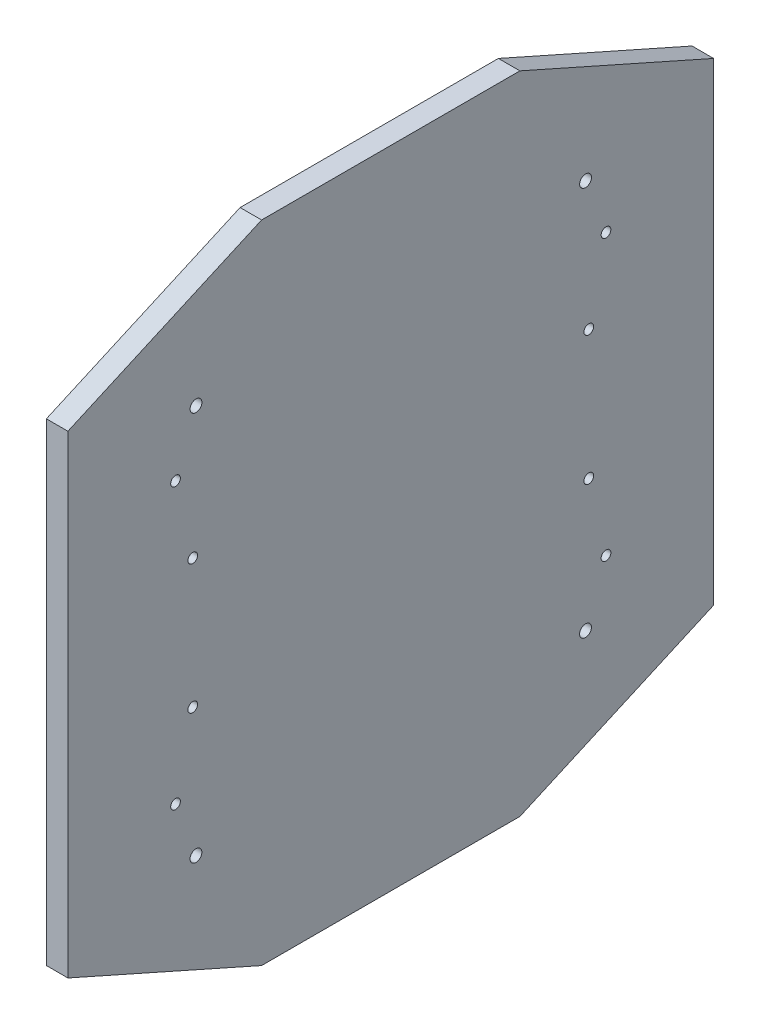
ISO-10303-21;
HEADER;
FILE_DESCRIPTION(('STEP AP214'),'2;1');
FILE_NAME('part.step','',(''),(''),'','','');
FILE_SCHEMA(('AUTOMOTIVE_DESIGN { 1 0 10303 214 1 1 1 1 }'));
ENDSEC;
DATA;
#1=APPLICATION_CONTEXT('core data for automotive mechanical design processes');
#2=APPLICATION_PROTOCOL_DEFINITION('international standard','automotive_design',2000,#1);
#3=PRODUCT_CONTEXT('',#1,'mechanical');
#4=PRODUCT('Part','Part','',(#3));
#5=PRODUCT_RELATED_PRODUCT_CATEGORY('part','',(#4));
#6=PRODUCT_DEFINITION_FORMATION('','',#4);
#7=PRODUCT_DEFINITION_CONTEXT('part definition',#1,'design');
#8=PRODUCT_DEFINITION('design','',#6,#7);
#9=PRODUCT_DEFINITION_SHAPE('','',#8);
#10=(LENGTH_UNIT() NAMED_UNIT(*) SI_UNIT(.MILLI.,.METRE.));
#11=(NAMED_UNIT(*) PLANE_ANGLE_UNIT() SI_UNIT($,.RADIAN.));
#12=(NAMED_UNIT(*) SI_UNIT($,.STERADIAN.) SOLID_ANGLE_UNIT());
#13=UNCERTAINTY_MEASURE_WITH_UNIT(LENGTH_MEASURE(1.E-05),#10,'distance_accuracy_value','');
#14=(GEOMETRIC_REPRESENTATION_CONTEXT(3) GLOBAL_UNCERTAINTY_ASSIGNED_CONTEXT((#13)) GLOBAL_UNIT_ASSIGNED_CONTEXT((#10,
#11,#12)) REPRESENTATION_CONTEXT('',''));
#15=CARTESIAN_POINT('',(0.,0.,0.));
#16=DIRECTION('',(0.,0.,1.));
#17=DIRECTION('',(1.,0.,0.));
#18=AXIS2_PLACEMENT_3D('',#15,#16,#17);
#19=CARTESIAN_POINT('',(10.,-110.,150.));
#20=DIRECTION('',(0.,0.913811548620257,-0.406138466053447));
#21=DIRECTION('',(0.,0.406138466053447,0.913811548620257));
#22=AXIS2_PLACEMENT_3D('',#19,#20,#21);
#23=PLANE('',#22);
#24=DIRECTION('',(0.,-0.406138466053447,-0.913811548620257));
#25=VECTOR('',#24,1.);
#26=CARTESIAN_POINT('',(0.,-110.,150.));
#27=LINE('',#26,#25);
#28=CARTESIAN_POINT('',(0.,-110.,150.));
#29=VERTEX_POINT('',#28);
#30=CARTESIAN_POINT('',(0.,-150.,60.));
#31=VERTEX_POINT('',#30);
#32=EDGE_CURVE('E133',#29,#31,#27,.T.);
#33=ORIENTED_EDGE('',*,*,#32,.T.);
#34=DIRECTION('',(-1.,0.,0.));
#35=VECTOR('',#34,1.);
#36=CARTESIAN_POINT('',(10.,-150.,60.));
#37=LINE('',#36,#35);
#38=CARTESIAN_POINT('',(10.,-150.,60.));
#39=VERTEX_POINT('',#38);
#40=EDGE_CURVE('E11',#39,#31,#37,.T.);
#41=ORIENTED_EDGE('',*,*,#40,.F.);
#42=DIRECTION('',(0.,-0.406138466053447,-0.913811548620257));
#43=VECTOR('',#42,1.);
#44=CARTESIAN_POINT('',(10.,-110.,150.));
#45=LINE('',#44,#43);
#46=CARTESIAN_POINT('',(10.,-110.,150.));
#47=VERTEX_POINT('',#46);
#48=EDGE_CURVE('E148',#47,#39,#45,.T.);
#49=ORIENTED_EDGE('',*,*,#48,.F.);
#50=DIRECTION('',(-1.,0.,0.));
#51=VECTOR('',#50,1.);
#52=CARTESIAN_POINT('',(10.,-110.,150.));
#53=LINE('',#52,#51);
#54=EDGE_CURVE('E129',#47,#29,#53,.T.);
#55=ORIENTED_EDGE('',*,*,#54,.T.);
#56=EDGE_LOOP('',(#33,#41,#49,#55));
#57=FACE_BOUND('',#56,.T.);
#58=ADVANCED_FACE('F37',(#57),#23,.F.);
#59=CARTESIAN_POINT('',(10.,-150.,60.));
#60=DIRECTION('',(0.,1.,0.));
#61=DIRECTION('',(0.,0.,1.));
#62=AXIS2_PLACEMENT_3D('',#59,#60,#61);
#63=PLANE('',#62);
#64=DIRECTION('',(0.,0.,-1.));
#65=VECTOR('',#64,1.);
#66=CARTESIAN_POINT('',(0.,-150.,60.));
#67=LINE('',#66,#65);
#68=CARTESIAN_POINT('',(0.,-150.,-60.));
#69=VERTEX_POINT('',#68);
#70=EDGE_CURVE('E136',#31,#69,#67,.T.);
#71=ORIENTED_EDGE('',*,*,#70,.T.);
#72=DIRECTION('',(-1.,0.,0.));
#73=VECTOR('',#72,1.);
#74=CARTESIAN_POINT('',(10.,-150.,-60.));
#75=LINE('',#74,#73);
#76=CARTESIAN_POINT('',(10.,-150.,-60.));
#77=VERTEX_POINT('',#76);
#78=EDGE_CURVE('E45',#77,#69,#75,.T.);
#79=ORIENTED_EDGE('',*,*,#78,.F.);
#80=DIRECTION('',(0.,0.,-1.));
#81=VECTOR('',#80,1.);
#82=CARTESIAN_POINT('',(10.,-150.,60.));
#83=LINE('',#82,#81);
#84=EDGE_CURVE('E96',#39,#77,#83,.T.);
#85=ORIENTED_EDGE('',*,*,#84,.F.);
#86=ORIENTED_EDGE('',*,*,#40,.T.);
#87=EDGE_LOOP('',(#71,#79,#85,#86));
#88=FACE_BOUND('',#87,.T.);
#89=ADVANCED_FACE('F303',(#88),#63,.F.);
#90=CARTESIAN_POINT('',(10.,-110.,-150.));
#91=DIRECTION('',(0.,0.913811548620257,0.406138466053447));
#92=DIRECTION('',(0.,-0.406138466053447,0.913811548620257));
#93=AXIS2_PLACEMENT_3D('',#90,#91,#92);
#94=PLANE('',#93);
#95=DIRECTION('',(0.,0.406138466053447,-0.913811548620257));
#96=VECTOR('',#95,1.);
#97=CARTESIAN_POINT('',(0.,-110.,-150.));
#98=LINE('',#97,#96);
#99=CARTESIAN_POINT('',(0.,-110.,-150.));
#100=VERTEX_POINT('',#99);
#101=EDGE_CURVE('E139',#69,#100,#98,.T.);
#102=ORIENTED_EDGE('',*,*,#101,.T.);
#103=DIRECTION('',(-1.,0.,0.));
#104=VECTOR('',#103,1.);
#105=CARTESIAN_POINT('',(10.,-110.,-150.));
#106=LINE('',#105,#104);
#107=CARTESIAN_POINT('',(10.,-110.,-150.));
#108=VERTEX_POINT('',#107);
#109=EDGE_CURVE('E155',#108,#100,#106,.T.);
#110=ORIENTED_EDGE('',*,*,#109,.F.);
#111=DIRECTION('',(0.,0.406138466053447,-0.913811548620257));
#112=VECTOR('',#111,1.);
#113=CARTESIAN_POINT('',(10.,-110.,-150.));
#114=LINE('',#113,#112);
#115=EDGE_CURVE('E163',#77,#108,#114,.T.);
#116=ORIENTED_EDGE('',*,*,#115,.F.);
#117=ORIENTED_EDGE('',*,*,#78,.T.);
#118=EDGE_LOOP('',(#102,#110,#116,#117));
#119=FACE_BOUND('',#118,.T.);
#120=ADVANCED_FACE('F161',(#119),#94,.F.);
#121=CARTESIAN_POINT('',(10.,-110.,-150.));
#122=DIRECTION('',(0.,0.,1.));
#123=DIRECTION('',(0.,-1.,0.));
#124=AXIS2_PLACEMENT_3D('',#121,#122,#123);
#125=PLANE('',#124);
#126=DIRECTION('',(0.,1.,0.));
#127=VECTOR('',#126,1.);
#128=CARTESIAN_POINT('',(0.,-110.,-150.));
#129=LINE('',#128,#127);
#130=CARTESIAN_POINT('',(0.,110.,-150.));
#131=VERTEX_POINT('',#130);
#132=EDGE_CURVE('E141',#100,#131,#129,.T.);
#133=ORIENTED_EDGE('',*,*,#132,.T.);
#134=DIRECTION('',(-1.,0.,0.));
#135=VECTOR('',#134,1.);
#136=CARTESIAN_POINT('',(10.,110.,-150.));
#137=LINE('',#136,#135);
#138=CARTESIAN_POINT('',(10.,110.,-150.));
#139=VERTEX_POINT('',#138);
#140=EDGE_CURVE('E152',#139,#131,#137,.T.);
#141=ORIENTED_EDGE('',*,*,#140,.F.);
#142=DIRECTION('',(0.,1.,0.));
#143=VECTOR('',#142,1.);
#144=CARTESIAN_POINT('',(10.,-110.,-150.));
#145=LINE('',#144,#143);
#146=EDGE_CURVE('E175',#108,#139,#145,.T.);
#147=ORIENTED_EDGE('',*,*,#146,.F.);
#148=ORIENTED_EDGE('',*,*,#109,.T.);
#149=EDGE_LOOP('',(#133,#141,#147,#148));
#150=FACE_BOUND('',#149,.T.);
#151=ADVANCED_FACE('F171',(#150),#125,.F.);
#152=CARTESIAN_POINT('',(10.,110.,-150.));
#153=DIRECTION('',(0.,-0.913811548620257,0.406138466053448));
#154=DIRECTION('',(0.,-0.406138466053448,-0.913811548620257));
#155=AXIS2_PLACEMENT_3D('',#152,#153,#154);
#156=PLANE('',#155);
#157=DIRECTION('',(0.,0.406138466053448,0.913811548620257));
#158=VECTOR('',#157,1.);
#159=CARTESIAN_POINT('',(0.,110.,-150.));
#160=LINE('',#159,#158);
#161=CARTESIAN_POINT('',(0.,150.,-60.));
#162=VERTEX_POINT('',#161);
#163=EDGE_CURVE('E143',#131,#162,#160,.T.);
#164=ORIENTED_EDGE('',*,*,#163,.T.);
#165=DIRECTION('',(-1.,0.,0.));
#166=VECTOR('',#165,1.);
#167=CARTESIAN_POINT('',(10.,150.,-60.));
#168=LINE('',#167,#166);
#169=CARTESIAN_POINT('',(10.,150.,-60.));
#170=VERTEX_POINT('',#169);
#171=EDGE_CURVE('E124',#170,#162,#168,.T.);
#172=ORIENTED_EDGE('',*,*,#171,.F.);
#173=DIRECTION('',(0.,0.406138466053448,0.913811548620257));
#174=VECTOR('',#173,1.);
#175=CARTESIAN_POINT('',(10.,110.,-150.));
#176=LINE('',#175,#174);
#177=EDGE_CURVE('E115',#139,#170,#176,.T.);
#178=ORIENTED_EDGE('',*,*,#177,.F.);
#179=ORIENTED_EDGE('',*,*,#140,.T.);
#180=EDGE_LOOP('',(#164,#172,#178,#179));
#181=FACE_BOUND('',#180,.T.);
#182=ADVANCED_FACE('F174',(#181),#156,.F.);
#183=CARTESIAN_POINT('',(10.,150.,60.));
#184=DIRECTION('',(0.,-1.,0.));
#185=DIRECTION('',(0.,0.,-1.));
#186=AXIS2_PLACEMENT_3D('',#183,#184,#185);
#187=PLANE('',#186);
#188=DIRECTION('',(0.,0.,1.));
#189=VECTOR('',#188,1.);
#190=CARTESIAN_POINT('',(0.,150.,60.));
#191=LINE('',#190,#189);
#192=CARTESIAN_POINT('',(0.,150.,60.));
#193=VERTEX_POINT('',#192);
#194=EDGE_CURVE('E123',#162,#193,#191,.T.);
#195=ORIENTED_EDGE('',*,*,#194,.T.);
#196=DIRECTION('',(-1.,0.,0.));
#197=VECTOR('',#196,1.);
#198=CARTESIAN_POINT('',(10.,150.,60.));
#199=LINE('',#198,#197);
#200=CARTESIAN_POINT('',(10.,150.,60.));
#201=VERTEX_POINT('',#200);
#202=EDGE_CURVE('E120',#201,#193,#199,.T.);
#203=ORIENTED_EDGE('',*,*,#202,.F.);
#204=DIRECTION('',(0.,0.,1.));
#205=VECTOR('',#204,1.);
#206=CARTESIAN_POINT('',(10.,150.,60.));
#207=LINE('',#206,#205);
#208=EDGE_CURVE('E109',#170,#201,#207,.T.);
#209=ORIENTED_EDGE('',*,*,#208,.F.);
#210=ORIENTED_EDGE('',*,*,#171,.T.);
#211=EDGE_LOOP('',(#195,#203,#209,#210));
#212=FACE_BOUND('',#211,.T.);
#213=ADVANCED_FACE('F121',(#212),#187,.F.);
#214=CARTESIAN_POINT('',(10.,110.,150.));
#215=DIRECTION('',(0.,-0.913811548620257,-0.406138466053448));
#216=DIRECTION('',(0.,0.406138466053448,-0.913811548620257));
#217=AXIS2_PLACEMENT_3D('',#214,#215,#216);
#218=PLANE('',#217);
#219=DIRECTION('',(0.,-0.406138466053448,0.913811548620257));
#220=VECTOR('',#219,1.);
#221=CARTESIAN_POINT('',(0.,110.,150.));
#222=LINE('',#221,#220);
#223=CARTESIAN_POINT('',(0.,110.,150.));
#224=VERTEX_POINT('',#223);
#225=EDGE_CURVE('E82',#193,#224,#222,.T.);
#226=ORIENTED_EDGE('',*,*,#225,.T.);
#227=DIRECTION('',(-1.,0.,0.));
#228=VECTOR('',#227,1.);
#229=CARTESIAN_POINT('',(10.,110.,150.));
#230=LINE('',#229,#228);
#231=CARTESIAN_POINT('',(10.,110.,150.));
#232=VERTEX_POINT('',#231);
#233=EDGE_CURVE('E125',#232,#224,#230,.T.);
#234=ORIENTED_EDGE('',*,*,#233,.F.);
#235=DIRECTION('',(0.,-0.406138466053448,0.913811548620257));
#236=VECTOR('',#235,1.);
#237=CARTESIAN_POINT('',(10.,110.,150.));
#238=LINE('',#237,#236);
#239=EDGE_CURVE('E113',#201,#232,#238,.T.);
#240=ORIENTED_EDGE('',*,*,#239,.F.);
#241=ORIENTED_EDGE('',*,*,#202,.T.);
#242=EDGE_LOOP('',(#226,#234,#240,#241));
#243=FACE_BOUND('',#242,.T.);
#244=ADVANCED_FACE('F127',(#243),#218,.F.);
#245=CARTESIAN_POINT('',(10.,-110.,150.));
#246=DIRECTION('',(0.,0.,-1.));
#247=DIRECTION('',(0.,1.,0.));
#248=AXIS2_PLACEMENT_3D('',#245,#246,#247);
#249=PLANE('',#248);
#250=DIRECTION('',(0.,-1.,0.));
#251=VECTOR('',#250,1.);
#252=CARTESIAN_POINT('',(0.,-110.,150.));
#253=LINE('',#252,#251);
#254=EDGE_CURVE('E88',#224,#29,#253,.T.);
#255=ORIENTED_EDGE('',*,*,#254,.T.);
#256=ORIENTED_EDGE('',*,*,#54,.F.);
#257=DIRECTION('',(0.,-1.,0.));
#258=VECTOR('',#257,1.);
#259=CARTESIAN_POINT('',(10.,-110.,150.));
#260=LINE('',#259,#258);
#261=EDGE_CURVE('E53',#232,#47,#260,.T.);
#262=ORIENTED_EDGE('',*,*,#261,.F.);
#263=ORIENTED_EDGE('',*,*,#233,.T.);
#264=EDGE_LOOP('',(#255,#256,#262,#263));
#265=FACE_BOUND('',#264,.T.);
#266=ADVANCED_FACE('F265',(#265),#249,.F.);
#267=CARTESIAN_POINT('',(10.,0.,0.));
#268=DIRECTION('',(1.,0.,0.));
#269=DIRECTION('',(0.,0.,-1.));
#270=AXIS2_PLACEMENT_3D('',#267,#268,#269);
#271=PLANE('',#270);
#272=CARTESIAN_POINT('',(10.,90.5,-90.5));
#273=DIRECTION('',(1.,0.,0.));
#274=DIRECTION('',(0.,0.,-1.));
#275=AXIS2_PLACEMENT_3D('',#272,#273,#274);
#276=CIRCLE('',#275,2.75000000000001);
#277=CARTESIAN_POINT('',(10.,90.5,-93.25));
#278=VERTEX_POINT('',#277);
#279=EDGE_CURVE('E242',#278,#278,#276,.T.);
#280=ORIENTED_EDGE('',*,*,#279,.F.);
#281=EDGE_LOOP('',(#280));
#282=FACE_BOUND('',#281,.T.);
#283=CARTESIAN_POINT('',(10.,-90.5,90.5));
#284=DIRECTION('',(1.,0.,0.));
#285=DIRECTION('',(0.,0.,-1.));
#286=AXIS2_PLACEMENT_3D('',#283,#284,#285);
#287=CIRCLE('',#286,2.75000000000001);
#288=CARTESIAN_POINT('',(10.,-90.5,87.75));
#289=VERTEX_POINT('',#288);
#290=EDGE_CURVE('E235',#289,#289,#287,.T.);
#291=ORIENTED_EDGE('',*,*,#290,.F.);
#292=EDGE_LOOP('',(#291));
#293=FACE_BOUND('',#292,.T.);
#294=CARTESIAN_POINT('',(10.,-90.5,-90.5));
#295=DIRECTION('',(1.,0.,0.));
#296=DIRECTION('',(0.,0.,-1.));
#297=AXIS2_PLACEMENT_3D('',#294,#295,#296);
#298=CIRCLE('',#297,2.75000000000001);
#299=CARTESIAN_POINT('',(10.,-90.5,-93.25));
#300=VERTEX_POINT('',#299);
#301=EDGE_CURVE('E247',#300,#300,#298,.T.);
#302=ORIENTED_EDGE('',*,*,#301,.F.);
#303=EDGE_LOOP('',(#302));
#304=FACE_BOUND('',#303,.T.);
#305=CARTESIAN_POINT('',(10.,90.5,90.5));
#306=DIRECTION('',(1.,0.,0.));
#307=DIRECTION('',(0.,0.,-1.));
#308=AXIS2_PLACEMENT_3D('',#305,#306,#307);
#309=CIRCLE('',#308,2.75000000000001);
#310=CARTESIAN_POINT('',(10.,90.5,87.75));
#311=VERTEX_POINT('',#310);
#312=EDGE_CURVE('E229',#311,#311,#309,.T.);
#313=ORIENTED_EDGE('',*,*,#312,.F.);
#314=EDGE_LOOP('',(#313));
#315=FACE_BOUND('',#314,.T.);
#316=CARTESIAN_POINT('',(10.,-30.,-92.));
#317=DIRECTION('',(1.,0.,0.));
#318=DIRECTION('',(0.,0.,-1.));
#319=AXIS2_PLACEMENT_3D('',#316,#317,#318);
#320=CIRCLE('',#319,2.25);
#321=CARTESIAN_POINT('',(10.,-30.,-94.25));
#322=VERTEX_POINT('',#321);
#323=EDGE_CURVE('E206',#322,#322,#320,.T.);
#324=ORIENTED_EDGE('',*,*,#323,.F.);
#325=EDGE_LOOP('',(#324));
#326=FACE_BOUND('',#325,.T.);
#327=CARTESIAN_POINT('',(10.,65.,-100.));
#328=DIRECTION('',(1.,0.,0.));
#329=DIRECTION('',(0.,0.,-1.));
#330=AXIS2_PLACEMENT_3D('',#327,#328,#329);
#331=CIRCLE('',#330,2.25);
#332=CARTESIAN_POINT('',(10.,65.,-102.25));
#333=VERTEX_POINT('',#332);
#334=EDGE_CURVE('E200',#333,#333,#331,.T.);
#335=ORIENTED_EDGE('',*,*,#334,.F.);
#336=EDGE_LOOP('',(#335));
#337=FACE_BOUND('',#336,.T.);
#338=CARTESIAN_POINT('',(10.,-65.,-100.));
#339=DIRECTION('',(1.,0.,0.));
#340=DIRECTION('',(0.,0.,-1.));
#341=AXIS2_PLACEMENT_3D('',#338,#339,#340);
#342=CIRCLE('',#341,2.25);
#343=CARTESIAN_POINT('',(10.,-65.,-102.25));
#344=VERTEX_POINT('',#343);
#345=EDGE_CURVE('E194',#344,#344,#342,.T.);
#346=ORIENTED_EDGE('',*,*,#345,.F.);
#347=EDGE_LOOP('',(#346));
#348=FACE_BOUND('',#347,.T.);
#349=CARTESIAN_POINT('',(10.,-65.,100.));
#350=DIRECTION('',(1.,0.,0.));
#351=DIRECTION('',(0.,0.,1.));
#352=AXIS2_PLACEMENT_3D('',#349,#350,#351);
#353=CIRCLE('',#352,2.25);
#354=CARTESIAN_POINT('',(10.,-65.,102.25));
#355=VERTEX_POINT('',#354);
#356=EDGE_CURVE('E187',#355,#355,#353,.T.);
#357=ORIENTED_EDGE('',*,*,#356,.F.);
#358=EDGE_LOOP('',(#357));
#359=FACE_BOUND('',#358,.T.);
#360=CARTESIAN_POINT('',(10.,30.,92.));
#361=DIRECTION('',(1.,0.,0.));
#362=DIRECTION('',(0.,0.,1.));
#363=AXIS2_PLACEMENT_3D('',#360,#361,#362);
#364=CIRCLE('',#363,2.25);
#365=CARTESIAN_POINT('',(10.,30.,94.25));
#366=VERTEX_POINT('',#365);
#367=EDGE_CURVE('E223',#366,#366,#364,.T.);
#368=ORIENTED_EDGE('',*,*,#367,.F.);
#369=EDGE_LOOP('',(#368));
#370=FACE_BOUND('',#369,.T.);
#371=CARTESIAN_POINT('',(10.,-30.,92.));
#372=DIRECTION('',(1.,0.,0.));
#373=DIRECTION('',(0.,0.,1.));
#374=AXIS2_PLACEMENT_3D('',#371,#372,#373);
#375=CIRCLE('',#374,2.25);
#376=CARTESIAN_POINT('',(10.,-30.,94.25));
#377=VERTEX_POINT('',#376);
#378=EDGE_CURVE('E211',#377,#377,#375,.T.);
#379=ORIENTED_EDGE('',*,*,#378,.F.);
#380=EDGE_LOOP('',(#379));
#381=FACE_BOUND('',#380,.T.);
#382=CARTESIAN_POINT('',(10.,65.,100.));
#383=DIRECTION('',(1.,0.,0.));
#384=DIRECTION('',(0.,0.,1.));
#385=AXIS2_PLACEMENT_3D('',#382,#383,#384);
#386=CIRCLE('',#385,2.25);
#387=CARTESIAN_POINT('',(10.,65.,102.25));
#388=VERTEX_POINT('',#387);
#389=EDGE_CURVE('E218',#388,#388,#386,.T.);
#390=ORIENTED_EDGE('',*,*,#389,.F.);
#391=EDGE_LOOP('',(#390));
#392=FACE_BOUND('',#391,.T.);
#393=CARTESIAN_POINT('',(10.,30.,-92.));
#394=DIRECTION('',(1.,0.,0.));
#395=DIRECTION('',(0.,0.,-1.));
#396=AXIS2_PLACEMENT_3D('',#393,#394,#395);
#397=CIRCLE('',#396,2.25);
#398=CARTESIAN_POINT('',(10.,30.,-94.25));
#399=VERTEX_POINT('',#398);
#400=EDGE_CURVE('E181',#399,#399,#397,.T.);
#401=ORIENTED_EDGE('',*,*,#400,.F.);
#402=EDGE_LOOP('',(#401));
#403=FACE_BOUND('',#402,.T.);
#404=ORIENTED_EDGE('',*,*,#48,.T.);
#405=ORIENTED_EDGE('',*,*,#84,.T.);
#406=ORIENTED_EDGE('',*,*,#115,.T.);
#407=ORIENTED_EDGE('',*,*,#146,.T.);
#408=ORIENTED_EDGE('',*,*,#177,.T.);
#409=ORIENTED_EDGE('',*,*,#208,.T.);
#410=ORIENTED_EDGE('',*,*,#239,.T.);
#411=ORIENTED_EDGE('',*,*,#261,.T.);
#412=EDGE_LOOP('',(#404,#405,#406,#407,#408,#409,#410,#411));
#413=FACE_BOUND('',#412,.T.);
#414=ADVANCED_FACE('F111',(#282,#293,#304,#315,#326,#337,#348,#359,#370,#381,#392,#403,#413),
#271,.T.);
#415=CARTESIAN_POINT('',(0.,0.,0.));
#416=DIRECTION('',(1.,0.,0.));
#417=DIRECTION('',(0.,0.,-1.));
#418=AXIS2_PLACEMENT_3D('',#415,#416,#417);
#419=PLANE('',#418);
#420=CARTESIAN_POINT('',(0.,90.5,-90.5));
#421=DIRECTION('',(1.,0.,0.));
#422=DIRECTION('',(0.,0.,-1.));
#423=AXIS2_PLACEMENT_3D('',#420,#421,#422);
#424=CIRCLE('',#423,2.75000000000001);
#425=CARTESIAN_POINT('',(0.,90.5,-93.25));
#426=VERTEX_POINT('',#425);
#427=EDGE_CURVE('E232',#426,#426,#424,.T.);
#428=ORIENTED_EDGE('',*,*,#427,.T.);
#429=EDGE_LOOP('',(#428));
#430=FACE_BOUND('',#429,.T.);
#431=CARTESIAN_POINT('',(0.,-90.5,90.5));
#432=DIRECTION('',(1.,0.,0.));
#433=DIRECTION('',(0.,0.,-1.));
#434=AXIS2_PLACEMENT_3D('',#431,#432,#433);
#435=CIRCLE('',#434,2.75000000000001);
#436=CARTESIAN_POINT('',(0.,-90.5,87.75));
#437=VERTEX_POINT('',#436);
#438=EDGE_CURVE('E238',#437,#437,#435,.T.);
#439=ORIENTED_EDGE('',*,*,#438,.T.);
#440=EDGE_LOOP('',(#439));
#441=FACE_BOUND('',#440,.T.);
#442=CARTESIAN_POINT('',(0.,-90.5,-90.5));
#443=DIRECTION('',(1.,0.,0.));
#444=DIRECTION('',(0.,0.,-1.));
#445=AXIS2_PLACEMENT_3D('',#442,#443,#444);
#446=CIRCLE('',#445,2.75000000000001);
#447=CARTESIAN_POINT('',(0.,-90.5,-93.25));
#448=VERTEX_POINT('',#447);
#449=EDGE_CURVE('E239',#448,#448,#446,.T.);
#450=ORIENTED_EDGE('',*,*,#449,.T.);
#451=EDGE_LOOP('',(#450));
#452=FACE_BOUND('',#451,.T.);
#453=CARTESIAN_POINT('',(0.,90.5,90.5));
#454=DIRECTION('',(1.,0.,0.));
#455=DIRECTION('',(0.,0.,-1.));
#456=AXIS2_PLACEMENT_3D('',#453,#454,#455);
#457=CIRCLE('',#456,2.75000000000001);
#458=CARTESIAN_POINT('',(0.,90.5,87.75));
#459=VERTEX_POINT('',#458);
#460=EDGE_CURVE('E226',#459,#459,#457,.T.);
#461=ORIENTED_EDGE('',*,*,#460,.T.);
#462=EDGE_LOOP('',(#461));
#463=FACE_BOUND('',#462,.T.);
#464=CARTESIAN_POINT('',(0.,-30.,-92.));
#465=DIRECTION('',(1.,0.,0.));
#466=DIRECTION('',(0.,0.,-1.));
#467=AXIS2_PLACEMENT_3D('',#464,#465,#466);
#468=CIRCLE('',#467,2.25);
#469=CARTESIAN_POINT('',(0.,-30.,-94.25));
#470=VERTEX_POINT('',#469);
#471=EDGE_CURVE('E184',#470,#470,#468,.T.);
#472=ORIENTED_EDGE('',*,*,#471,.T.);
#473=EDGE_LOOP('',(#472));
#474=FACE_BOUND('',#473,.T.);
#475=CARTESIAN_POINT('',(0.,65.,-100.));
#476=DIRECTION('',(1.,0.,0.));
#477=DIRECTION('',(0.,0.,-1.));
#478=AXIS2_PLACEMENT_3D('',#475,#476,#477);
#479=CIRCLE('',#478,2.25);
#480=CARTESIAN_POINT('',(0.,65.,-102.25));
#481=VERTEX_POINT('',#480);
#482=EDGE_CURVE('E203',#481,#481,#479,.T.);
#483=ORIENTED_EDGE('',*,*,#482,.T.);
#484=EDGE_LOOP('',(#483));
#485=FACE_BOUND('',#484,.T.);
#486=CARTESIAN_POINT('',(0.,-65.,-100.));
#487=DIRECTION('',(1.,0.,0.));
#488=DIRECTION('',(0.,0.,-1.));
#489=AXIS2_PLACEMENT_3D('',#486,#487,#488);
#490=CIRCLE('',#489,2.25);
#491=CARTESIAN_POINT('',(0.,-65.,-102.25));
#492=VERTEX_POINT('',#491);
#493=EDGE_CURVE('E197',#492,#492,#490,.T.);
#494=ORIENTED_EDGE('',*,*,#493,.T.);
#495=EDGE_LOOP('',(#494));
#496=FACE_BOUND('',#495,.T.);
#497=CARTESIAN_POINT('',(0.,-65.,100.));
#498=DIRECTION('',(1.,0.,0.));
#499=DIRECTION('',(0.,0.,1.));
#500=AXIS2_PLACEMENT_3D('',#497,#498,#499);
#501=CIRCLE('',#500,2.25);
#502=CARTESIAN_POINT('',(0.,-65.,102.25));
#503=VERTEX_POINT('',#502);
#504=EDGE_CURVE('E190',#503,#503,#501,.T.);
#505=ORIENTED_EDGE('',*,*,#504,.T.);
#506=EDGE_LOOP('',(#505));
#507=FACE_BOUND('',#506,.T.);
#508=CARTESIAN_POINT('',(0.,30.,92.));
#509=DIRECTION('',(1.,0.,0.));
#510=DIRECTION('',(0.,0.,1.));
#511=AXIS2_PLACEMENT_3D('',#508,#509,#510);
#512=CIRCLE('',#511,2.25);
#513=CARTESIAN_POINT('',(0.,30.,94.25));
#514=VERTEX_POINT('',#513);
#515=EDGE_CURVE('E215',#514,#514,#512,.T.);
#516=ORIENTED_EDGE('',*,*,#515,.T.);
#517=EDGE_LOOP('',(#516));
#518=FACE_BOUND('',#517,.T.);
#519=CARTESIAN_POINT('',(0.,-30.,92.));
#520=DIRECTION('',(1.,0.,0.));
#521=DIRECTION('',(0.,0.,1.));
#522=AXIS2_PLACEMENT_3D('',#519,#520,#521);
#523=CIRCLE('',#522,2.25);
#524=CARTESIAN_POINT('',(0.,-30.,94.25));
#525=VERTEX_POINT('',#524);
#526=EDGE_CURVE('E214',#525,#525,#523,.T.);
#527=ORIENTED_EDGE('',*,*,#526,.T.);
#528=EDGE_LOOP('',(#527));
#529=FACE_BOUND('',#528,.T.);
#530=CARTESIAN_POINT('',(0.,65.,100.));
#531=DIRECTION('',(1.,0.,0.));
#532=DIRECTION('',(0.,0.,1.));
#533=AXIS2_PLACEMENT_3D('',#530,#531,#532);
#534=CIRCLE('',#533,2.25);
#535=CARTESIAN_POINT('',(0.,65.,102.25));
#536=VERTEX_POINT('',#535);
#537=EDGE_CURVE('E191',#536,#536,#534,.T.);
#538=ORIENTED_EDGE('',*,*,#537,.T.);
#539=EDGE_LOOP('',(#538));
#540=FACE_BOUND('',#539,.T.);
#541=CARTESIAN_POINT('',(0.,30.,-92.));
#542=DIRECTION('',(1.,0.,0.));
#543=DIRECTION('',(0.,0.,-1.));
#544=AXIS2_PLACEMENT_3D('',#541,#542,#543);
#545=CIRCLE('',#544,2.25);
#546=CARTESIAN_POINT('',(0.,30.,-94.25));
#547=VERTEX_POINT('',#546);
#548=EDGE_CURVE('E137',#547,#547,#545,.T.);
#549=ORIENTED_EDGE('',*,*,#548,.T.);
#550=EDGE_LOOP('',(#549));
#551=FACE_BOUND('',#550,.T.);
#552=ORIENTED_EDGE('',*,*,#32,.F.);
#553=ORIENTED_EDGE('',*,*,#254,.F.);
#554=ORIENTED_EDGE('',*,*,#225,.F.);
#555=ORIENTED_EDGE('',*,*,#194,.F.);
#556=ORIENTED_EDGE('',*,*,#163,.F.);
#557=ORIENTED_EDGE('',*,*,#132,.F.);
#558=ORIENTED_EDGE('',*,*,#101,.F.);
#559=ORIENTED_EDGE('',*,*,#70,.F.);
#560=EDGE_LOOP('',(#552,#553,#554,#555,#556,#557,#558,#559));
#561=FACE_BOUND('',#560,.T.);
#562=ADVANCED_FACE('F167',(#430,#441,#452,#463,#474,#485,#496,#507,#518,#529,#540,#551,#561),
#419,.F.);
#563=CARTESIAN_POINT('',(0.,30.,-92.));
#564=DIRECTION('',(1.,0.,0.));
#565=DIRECTION('',(0.,0.,-1.));
#566=AXIS2_PLACEMENT_3D('',#563,#564,#565);
#567=CYLINDRICAL_SURFACE('',#566,2.25);
#568=ORIENTED_EDGE('',*,*,#548,.F.);
#569=EDGE_LOOP('',(#568));
#570=FACE_BOUND('',#569,.T.);
#571=ORIENTED_EDGE('',*,*,#400,.T.);
#572=EDGE_LOOP('',(#571));
#573=FACE_BOUND('',#572,.T.);
#574=ADVANCED_FACE('F286',(#570,#573),#567,.F.);
#575=CARTESIAN_POINT('',(0.,65.,100.));
#576=DIRECTION('',(1.,0.,0.));
#577=DIRECTION('',(0.,0.,-1.));
#578=AXIS2_PLACEMENT_3D('',#575,#576,#577);
#579=CYLINDRICAL_SURFACE('',#578,2.25);
#580=ORIENTED_EDGE('',*,*,#537,.F.);
#581=EDGE_LOOP('',(#580));
#582=FACE_BOUND('',#581,.T.);
#583=ORIENTED_EDGE('',*,*,#389,.T.);
#584=EDGE_LOOP('',(#583));
#585=FACE_BOUND('',#584,.T.);
#586=ADVANCED_FACE('F288',(#582,#585),#579,.F.);
#587=CARTESIAN_POINT('',(0.,-30.,92.));
#588=DIRECTION('',(1.,0.,0.));
#589=DIRECTION('',(0.,0.,-1.));
#590=AXIS2_PLACEMENT_3D('',#587,#588,#589);
#591=CYLINDRICAL_SURFACE('',#590,2.25);
#592=ORIENTED_EDGE('',*,*,#526,.F.);
#593=EDGE_LOOP('',(#592));
#594=FACE_BOUND('',#593,.T.);
#595=ORIENTED_EDGE('',*,*,#378,.T.);
#596=EDGE_LOOP('',(#595));
#597=FACE_BOUND('',#596,.T.);
#598=ADVANCED_FACE('F295',(#594,#597),#591,.F.);
#599=CARTESIAN_POINT('',(0.,30.,92.));
#600=DIRECTION('',(1.,0.,0.));
#601=DIRECTION('',(0.,0.,-1.));
#602=AXIS2_PLACEMENT_3D('',#599,#600,#601);
#603=CYLINDRICAL_SURFACE('',#602,2.25);
#604=ORIENTED_EDGE('',*,*,#515,.F.);
#605=EDGE_LOOP('',(#604));
#606=FACE_BOUND('',#605,.T.);
#607=ORIENTED_EDGE('',*,*,#367,.T.);
#608=EDGE_LOOP('',(#607));
#609=FACE_BOUND('',#608,.T.);
#610=ADVANCED_FACE('F369',(#606,#609),#603,.F.);
#611=CARTESIAN_POINT('',(0.,-65.,100.));
#612=DIRECTION('',(1.,0.,0.));
#613=DIRECTION('',(0.,0.,-1.));
#614=AXIS2_PLACEMENT_3D('',#611,#612,#613);
#615=CYLINDRICAL_SURFACE('',#614,2.25);
#616=ORIENTED_EDGE('',*,*,#504,.F.);
#617=EDGE_LOOP('',(#616));
#618=FACE_BOUND('',#617,.T.);
#619=ORIENTED_EDGE('',*,*,#356,.T.);
#620=EDGE_LOOP('',(#619));
#621=FACE_BOUND('',#620,.T.);
#622=ADVANCED_FACE('F379',(#618,#621),#615,.F.);
#623=CARTESIAN_POINT('',(0.,-65.,-100.));
#624=DIRECTION('',(1.,0.,0.));
#625=DIRECTION('',(0.,0.,-1.));
#626=AXIS2_PLACEMENT_3D('',#623,#624,#625);
#627=CYLINDRICAL_SURFACE('',#626,2.25);
#628=ORIENTED_EDGE('',*,*,#493,.F.);
#629=EDGE_LOOP('',(#628));
#630=FACE_BOUND('',#629,.T.);
#631=ORIENTED_EDGE('',*,*,#345,.T.);
#632=EDGE_LOOP('',(#631));
#633=FACE_BOUND('',#632,.T.);
#634=ADVANCED_FACE('F389',(#630,#633),#627,.F.);
#635=CARTESIAN_POINT('',(0.,65.,-100.));
#636=DIRECTION('',(1.,0.,0.));
#637=DIRECTION('',(0.,0.,-1.));
#638=AXIS2_PLACEMENT_3D('',#635,#636,#637);
#639=CYLINDRICAL_SURFACE('',#638,2.25);
#640=ORIENTED_EDGE('',*,*,#482,.F.);
#641=EDGE_LOOP('',(#640));
#642=FACE_BOUND('',#641,.T.);
#643=ORIENTED_EDGE('',*,*,#334,.T.);
#644=EDGE_LOOP('',(#643));
#645=FACE_BOUND('',#644,.T.);
#646=ADVANCED_FACE('F398',(#642,#645),#639,.F.);
#647=CARTESIAN_POINT('',(0.,-30.,-92.));
#648=DIRECTION('',(1.,0.,0.));
#649=DIRECTION('',(0.,0.,-1.));
#650=AXIS2_PLACEMENT_3D('',#647,#648,#649);
#651=CYLINDRICAL_SURFACE('',#650,2.25);
#652=ORIENTED_EDGE('',*,*,#471,.F.);
#653=EDGE_LOOP('',(#652));
#654=FACE_BOUND('',#653,.T.);
#655=ORIENTED_EDGE('',*,*,#323,.T.);
#656=EDGE_LOOP('',(#655));
#657=FACE_BOUND('',#656,.T.);
#658=ADVANCED_FACE('F408',(#654,#657),#651,.F.);
#659=CARTESIAN_POINT('',(0.,90.5,90.5));
#660=DIRECTION('',(1.,0.,0.));
#661=DIRECTION('',(0.,0.,-1.));
#662=AXIS2_PLACEMENT_3D('',#659,#660,#661);
#663=CYLINDRICAL_SURFACE('',#662,2.75000000000001);
#664=ORIENTED_EDGE('',*,*,#460,.F.);
#665=EDGE_LOOP('',(#664));
#666=FACE_BOUND('',#665,.T.);
#667=ORIENTED_EDGE('',*,*,#312,.T.);
#668=EDGE_LOOP('',(#667));
#669=FACE_BOUND('',#668,.T.);
#670=ADVANCED_FACE('F259',(#666,#669),#663,.F.);
#671=CARTESIAN_POINT('',(0.,-90.5,-90.5));
#672=DIRECTION('',(1.,0.,0.));
#673=DIRECTION('',(0.,0.,-1.));
#674=AXIS2_PLACEMENT_3D('',#671,#672,#673);
#675=CYLINDRICAL_SURFACE('',#674,2.75000000000001);
#676=ORIENTED_EDGE('',*,*,#449,.F.);
#677=EDGE_LOOP('',(#676));
#678=FACE_BOUND('',#677,.T.);
#679=ORIENTED_EDGE('',*,*,#301,.T.);
#680=EDGE_LOOP('',(#679));
#681=FACE_BOUND('',#680,.T.);
#682=ADVANCED_FACE('F255',(#678,#681),#675,.F.);
#683=CARTESIAN_POINT('',(0.,-90.5,90.5));
#684=DIRECTION('',(1.,0.,0.));
#685=DIRECTION('',(0.,0.,-1.));
#686=AXIS2_PLACEMENT_3D('',#683,#684,#685);
#687=CYLINDRICAL_SURFACE('',#686,2.75000000000001);
#688=ORIENTED_EDGE('',*,*,#438,.F.);
#689=EDGE_LOOP('',(#688));
#690=FACE_BOUND('',#689,.T.);
#691=ORIENTED_EDGE('',*,*,#290,.T.);
#692=EDGE_LOOP('',(#691));
#693=FACE_BOUND('',#692,.T.);
#694=ADVANCED_FACE('F258',(#690,#693),#687,.F.);
#695=CARTESIAN_POINT('',(0.,90.5,-90.5));
#696=DIRECTION('',(1.,0.,0.));
#697=DIRECTION('',(0.,0.,-1.));
#698=AXIS2_PLACEMENT_3D('',#695,#696,#697);
#699=CYLINDRICAL_SURFACE('',#698,2.75000000000001);
#700=ORIENTED_EDGE('',*,*,#427,.F.);
#701=EDGE_LOOP('',(#700));
#702=FACE_BOUND('',#701,.T.);
#703=ORIENTED_EDGE('',*,*,#279,.T.);
#704=EDGE_LOOP('',(#703));
#705=FACE_BOUND('',#704,.T.);
#706=ADVANCED_FACE('F452',(#702,#705),#699,.F.);
#707=CLOSED_SHELL('',(#58,#89,#120,#151,#182,#213,#244,#266,#414,#562,#574,#586,#598,#610,#622,
#634,#646,#658,#670,#682,#694,#706));
#708=MANIFOLD_SOLID_BREP('B2',#707);
#709=ADVANCED_BREP_SHAPE_REPRESENTATION('',(#18,#708),#14);
#710=SHAPE_DEFINITION_REPRESENTATION(#9,#709);
ENDSEC;
END-ISO-10303-21;
